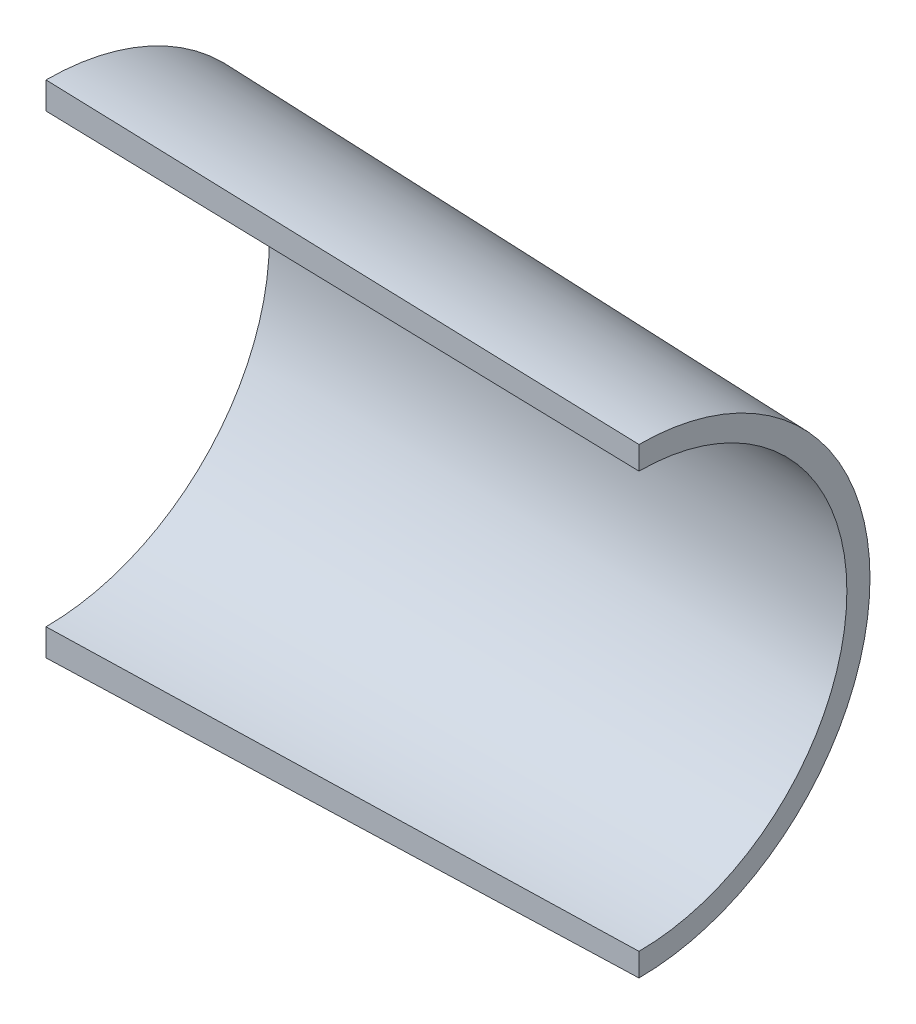
ISO-10303-21;
HEADER;
FILE_DESCRIPTION(('STEP AP214'),'2;1');
FILE_NAME('part.step','',(''),(''),'','','');
FILE_SCHEMA(('AUTOMOTIVE_DESIGN { 1 0 10303 214 1 1 1 1 }'));
ENDSEC;
DATA;
#1=APPLICATION_CONTEXT('core data for automotive mechanical design processes');
#2=APPLICATION_PROTOCOL_DEFINITION('international standard','automotive_design',2000,#1);
#3=PRODUCT_CONTEXT('',#1,'mechanical');
#4=PRODUCT('Part','Part','',(#3));
#5=PRODUCT_RELATED_PRODUCT_CATEGORY('part','',(#4));
#6=PRODUCT_DEFINITION_FORMATION('','',#4);
#7=PRODUCT_DEFINITION_CONTEXT('part definition',#1,'design');
#8=PRODUCT_DEFINITION('design','',#6,#7);
#9=PRODUCT_DEFINITION_SHAPE('','',#8);
#10=(LENGTH_UNIT() NAMED_UNIT(*) SI_UNIT(.MILLI.,.METRE.));
#11=(NAMED_UNIT(*) PLANE_ANGLE_UNIT() SI_UNIT($,.RADIAN.));
#12=(NAMED_UNIT(*) SI_UNIT($,.STERADIAN.) SOLID_ANGLE_UNIT());
#13=UNCERTAINTY_MEASURE_WITH_UNIT(LENGTH_MEASURE(1.E-05),#10,'distance_accuracy_value','');
#14=(GEOMETRIC_REPRESENTATION_CONTEXT(3) GLOBAL_UNCERTAINTY_ASSIGNED_CONTEXT((#13)) GLOBAL_UNIT_ASSIGNED_CONTEXT((#10,
#11,#12)) REPRESENTATION_CONTEXT('',''));
#15=CARTESIAN_POINT('',(0.,0.,0.));
#16=DIRECTION('',(0.,0.,1.));
#17=DIRECTION('',(1.,0.,0.));
#18=AXIS2_PLACEMENT_3D('',#15,#16,#17);
#19=CARTESIAN_POINT('',(3420.,0.,0.));
#20=DIRECTION('',(-1.,0.,0.));
#21=DIRECTION('',(0.,0.,1.));
#22=AXIS2_PLACEMENT_3D('',#19,#20,#21);
#23=CONICAL_SURFACE('',#22,540.,0.0259681872115563);
#24=CARTESIAN_POINT('',(1880.,0.,0.));
#25=DIRECTION('',(-1.,0.,0.));
#26=DIRECTION('',(0.,0.,1.));
#27=AXIS2_PLACEMENT_3D('',#24,#25,#26);
#28=CIRCLE('',#27,580.);
#29=CARTESIAN_POINT('',(1880.,579.999999999999,-3.10820800386332E-05));
#30=VERTEX_POINT('',#29);
#31=CARTESIAN_POINT('',(1880.,-580.,0.));
#32=VERTEX_POINT('',#31);
#33=EDGE_CURVE('E11',#30,#32,#28,.T.);
#34=ORIENTED_EDGE('',*,*,#33,.T.);
#35=DIRECTION('',(-0.999662845573694,-0.0259652687161998,0.));
#36=VECTOR('',#35,1.);
#37=CARTESIAN_POINT('',(3420.,-540.,0.));
#38=LINE('',#37,#36);
#39=CARTESIAN_POINT('',(3420.,-540.,0.));
#40=VERTEX_POINT('',#39);
#41=EDGE_CURVE('E80',#40,#32,#38,.T.);
#42=ORIENTED_EDGE('',*,*,#41,.F.);
#43=CARTESIAN_POINT('',(3420.,0.,0.));
#44=DIRECTION('',(-1.,0.,0.));
#45=DIRECTION('',(0.,0.,1.));
#46=AXIS2_PLACEMENT_3D('',#43,#44,#45);
#47=CIRCLE('',#46,540.);
#48=CARTESIAN_POINT('',(3420.,539.999999999999,-2.89384883118309E-05));
#49=VERTEX_POINT('',#48);
#50=EDGE_CURVE('E53',#49,#40,#47,.T.);
#51=ORIENTED_EDGE('',*,*,#50,.F.);
#52=DIRECTION('',(-0.999662845573694,0.0259652687161998,-1.39147338010611E-09));
#53=VECTOR('',#52,1.);
#54=CARTESIAN_POINT('',(3420.,539.999999999999,-2.89384883118309E-05));
#55=LINE('',#54,#53);
#56=EDGE_CURVE('E83',#49,#30,#55,.T.);
#57=ORIENTED_EDGE('',*,*,#56,.T.);
#58=EDGE_LOOP('',(#34,#42,#51,#57));
#59=FACE_BOUND('',#58,.T.);
#60=ADVANCED_FACE('F39',(#59),#23,.F.);
#61=CARTESIAN_POINT('',(1880.,579.999999999999,-3.10820800386332E-05));
#62=DIRECTION('',(-1.,0.,0.));
#63=DIRECTION('',(0.,0.,1.));
#64=AXIS2_PLACEMENT_3D('',#61,#62,#63);
#65=PLANE('',#64);
#66=CARTESIAN_POINT('',(1880.,0.,0.));
#67=DIRECTION('',(-1.,0.,0.));
#68=DIRECTION('',(0.,0.,1.));
#69=AXIS2_PLACEMENT_3D('',#66,#67,#68);
#70=CIRCLE('',#69,650.);
#71=CARTESIAN_POINT('',(1880.,649.999999999999,-3.48333655605372E-05));
#72=VERTEX_POINT('',#71);
#73=CARTESIAN_POINT('',(1880.,-650.,0.));
#74=VERTEX_POINT('',#73);
#75=EDGE_CURVE('E50',#72,#74,#70,.T.);
#76=ORIENTED_EDGE('',*,*,#75,.T.);
#77=DIRECTION('',(0.,-1.,0.));
#78=VECTOR('',#77,1.);
#79=CARTESIAN_POINT('',(1880.,-580.,0.));
#80=LINE('',#79,#78);
#81=EDGE_CURVE('E89',#32,#74,#80,.T.);
#82=ORIENTED_EDGE('',*,*,#81,.F.);
#83=ORIENTED_EDGE('',*,*,#33,.F.);
#84=DIRECTION('',(0.,0.999999999999999,-5.35897931700572E-08));
#85=VECTOR('',#84,1.);
#86=CARTESIAN_POINT('',(1880.,579.999999999999,-3.10820800386332E-05));
#87=LINE('',#86,#85);
#88=EDGE_CURVE('E99',#30,#72,#87,.T.);
#89=ORIENTED_EDGE('',*,*,#88,.T.);
#90=EDGE_LOOP('',(#76,#82,#83,#89));
#91=FACE_BOUND('',#90,.T.);
#92=ADVANCED_FACE('F41',(#91),#65,.T.);
#93=CARTESIAN_POINT('',(1880.,0.,0.));
#94=DIRECTION('',(-1.,0.,0.));
#95=DIRECTION('',(0.,0.,1.));
#96=AXIS2_PLACEMENT_3D('',#93,#94,#95);
#97=CONICAL_SURFACE('',#96,650.,0.0324561312290194);
#98=CARTESIAN_POINT('',(3420.,0.,0.));
#99=DIRECTION('',(-1.,0.,0.));
#100=DIRECTION('',(0.,0.,1.));
#101=AXIS2_PLACEMENT_3D('',#98,#99,#100);
#102=CIRCLE('',#101,600.);
#103=CARTESIAN_POINT('',(3420.,599.999999999999,-3.21538759020343E-05));
#104=VERTEX_POINT('',#103);
#105=CARTESIAN_POINT('',(3420.,-600.,0.));
#106=VERTEX_POINT('',#105);
#107=EDGE_CURVE('E62',#104,#106,#102,.T.);
#108=ORIENTED_EDGE('',*,*,#107,.T.);
#109=DIRECTION('',(0.999473346006721,0.0324504333119065,0.));
#110=VECTOR('',#109,1.);
#111=CARTESIAN_POINT('',(1880.,-650.,0.));
#112=LINE('',#111,#110);
#113=EDGE_CURVE('E92',#74,#106,#112,.T.);
#114=ORIENTED_EDGE('',*,*,#113,.F.);
#115=ORIENTED_EDGE('',*,*,#75,.F.);
#116=DIRECTION('',(0.999473346006721,-0.0324504333119065,1.73901200946381E-09));
#117=VECTOR('',#116,1.);
#118=CARTESIAN_POINT('',(1880.,649.999999999999,-3.48333655605372E-05));
#119=LINE('',#118,#117);
#120=EDGE_CURVE('E105',#72,#104,#119,.T.);
#121=ORIENTED_EDGE('',*,*,#120,.T.);
#122=EDGE_LOOP('',(#108,#114,#115,#121));
#123=FACE_BOUND('',#122,.T.);
#124=ADVANCED_FACE('F109',(#123),#97,.T.);
#125=CARTESIAN_POINT('',(3420.,599.999999999999,-3.21538759020343E-05));
#126=DIRECTION('',(1.,0.,0.));
#127=DIRECTION('',(0.,0.,-1.));
#128=AXIS2_PLACEMENT_3D('',#125,#126,#127);
#129=PLANE('',#128);
#130=DIRECTION('',(0.,-0.999999999999999,5.35897931700572E-08));
#131=VECTOR('',#130,1.);
#132=CARTESIAN_POINT('',(3420.,599.999999999999,-3.21538759020343E-05));
#133=LINE('',#132,#131);
#134=EDGE_CURVE('E101',#104,#49,#133,.T.);
#135=ORIENTED_EDGE('',*,*,#134,.T.);
#136=ORIENTED_EDGE('',*,*,#50,.T.);
#137=DIRECTION('',(0.,1.,0.));
#138=VECTOR('',#137,1.);
#139=CARTESIAN_POINT('',(3420.,-600.,0.));
#140=LINE('',#139,#138);
#141=EDGE_CURVE('E95',#106,#40,#140,.T.);
#142=ORIENTED_EDGE('',*,*,#141,.F.);
#143=ORIENTED_EDGE('',*,*,#107,.F.);
#144=EDGE_LOOP('',(#135,#136,#142,#143));
#145=FACE_BOUND('',#144,.T.);
#146=ADVANCED_FACE('F112',(#145),#129,.T.);
#147=CARTESIAN_POINT('',(0.,0.,0.));
#148=DIRECTION('',(0.,-5.35897931700572E-08,-0.999999999999999));
#149=DIRECTION('',(1.,0.,0.));
#150=AXIS2_PLACEMENT_3D('',#147,#148,#149);
#151=PLANE('',#150);
#152=ORIENTED_EDGE('',*,*,#56,.F.);
#153=ORIENTED_EDGE('',*,*,#134,.F.);
#154=ORIENTED_EDGE('',*,*,#120,.F.);
#155=ORIENTED_EDGE('',*,*,#88,.F.);
#156=EDGE_LOOP('',(#152,#153,#154,#155));
#157=FACE_BOUND('',#156,.T.);
#158=ADVANCED_FACE('F111',(#157),#151,.F.);
#159=CARTESIAN_POINT('',(0.,0.,0.));
#160=DIRECTION('',(0.,0.,1.));
#161=DIRECTION('',(1.,0.,0.));
#162=AXIS2_PLACEMENT_3D('',#159,#160,#161);
#163=PLANE('',#162);
#164=ORIENTED_EDGE('',*,*,#41,.T.);
#165=ORIENTED_EDGE('',*,*,#81,.T.);
#166=ORIENTED_EDGE('',*,*,#113,.T.);
#167=ORIENTED_EDGE('',*,*,#141,.T.);
#168=EDGE_LOOP('',(#164,#165,#166,#167));
#169=FACE_BOUND('',#168,.T.);
#170=ADVANCED_FACE('F88',(#169),#163,.T.);
#171=CLOSED_SHELL('',(#60,#92,#124,#146,#158,#170));
#172=MANIFOLD_SOLID_BREP('B2',#171);
#173=ADVANCED_BREP_SHAPE_REPRESENTATION('',(#18,#172),#14);
#174=SHAPE_DEFINITION_REPRESENTATION(#9,#173);
ENDSEC;
END-ISO-10303-21;
